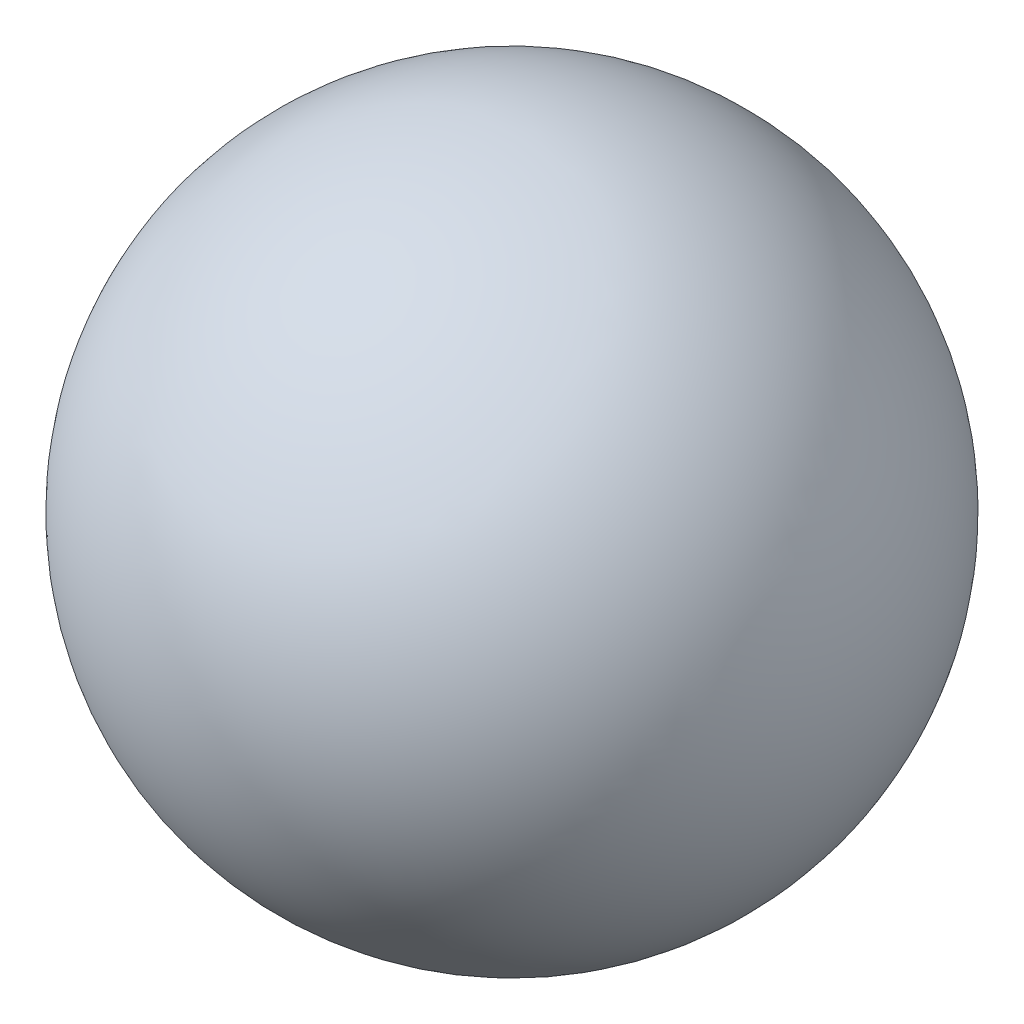
ISO-10303-21;
HEADER;
FILE_DESCRIPTION(('STEP AP214'),'2;1');
FILE_NAME('part.step','',(''),(''),'','','');
FILE_SCHEMA(('AUTOMOTIVE_DESIGN { 1 0 10303 214 1 1 1 1 }'));
ENDSEC;
DATA;
#1=APPLICATION_CONTEXT('core data for automotive mechanical design processes');
#2=APPLICATION_PROTOCOL_DEFINITION('international standard','automotive_design',2000,#1);
#3=PRODUCT_CONTEXT('',#1,'mechanical');
#4=PRODUCT('Part','Part','',(#3));
#5=PRODUCT_RELATED_PRODUCT_CATEGORY('part','',(#4));
#6=PRODUCT_DEFINITION_FORMATION('','',#4);
#7=PRODUCT_DEFINITION_CONTEXT('part definition',#1,'design');
#8=PRODUCT_DEFINITION('design','',#6,#7);
#9=PRODUCT_DEFINITION_SHAPE('','',#8);
#10=(LENGTH_UNIT() NAMED_UNIT(*) SI_UNIT(.MILLI.,.METRE.));
#11=(NAMED_UNIT(*) PLANE_ANGLE_UNIT() SI_UNIT($,.RADIAN.));
#12=(NAMED_UNIT(*) SI_UNIT($,.STERADIAN.) SOLID_ANGLE_UNIT());
#13=UNCERTAINTY_MEASURE_WITH_UNIT(LENGTH_MEASURE(1.E-05),#10,'distance_accuracy_value','');
#14=(GEOMETRIC_REPRESENTATION_CONTEXT(3) GLOBAL_UNCERTAINTY_ASSIGNED_CONTEXT((#13)) GLOBAL_UNIT_ASSIGNED_CONTEXT((#10,
#11,#12)) REPRESENTATION_CONTEXT('',''));
#15=CARTESIAN_POINT('',(0.,0.,0.));
#16=DIRECTION('',(0.,0.,1.));
#17=DIRECTION('',(1.,0.,0.));
#18=AXIS2_PLACEMENT_3D('',#15,#16,#17);
#19=CARTESIAN_POINT('',(0.,0.,0.));
#20=DIRECTION('',(-1.,0.,0.));
#21=DIRECTION('',(0.,1.,0.));
#22=AXIS2_PLACEMENT_3D('',#19,#20,#21);
#23=SPHERICAL_SURFACE('',#22,21.745125);
#24=CARTESIAN_POINT('',(-21.745125,0.,0.));
#25=VERTEX_POINT('',#24);
#26=VERTEX_LOOP('',#25);
#27=FACE_BOUND('',#26,.T.);
#28=ADVANCED_FACE('F30',(#27),#23,.T.);
#29=CLOSED_SHELL('',(#28));
#30=MANIFOLD_SOLID_BREP('B2',#29);
#31=ADVANCED_BREP_SHAPE_REPRESENTATION('',(#18,#30),#14);
#32=SHAPE_DEFINITION_REPRESENTATION(#9,#31);
ENDSEC;
END-ISO-10303-21;
